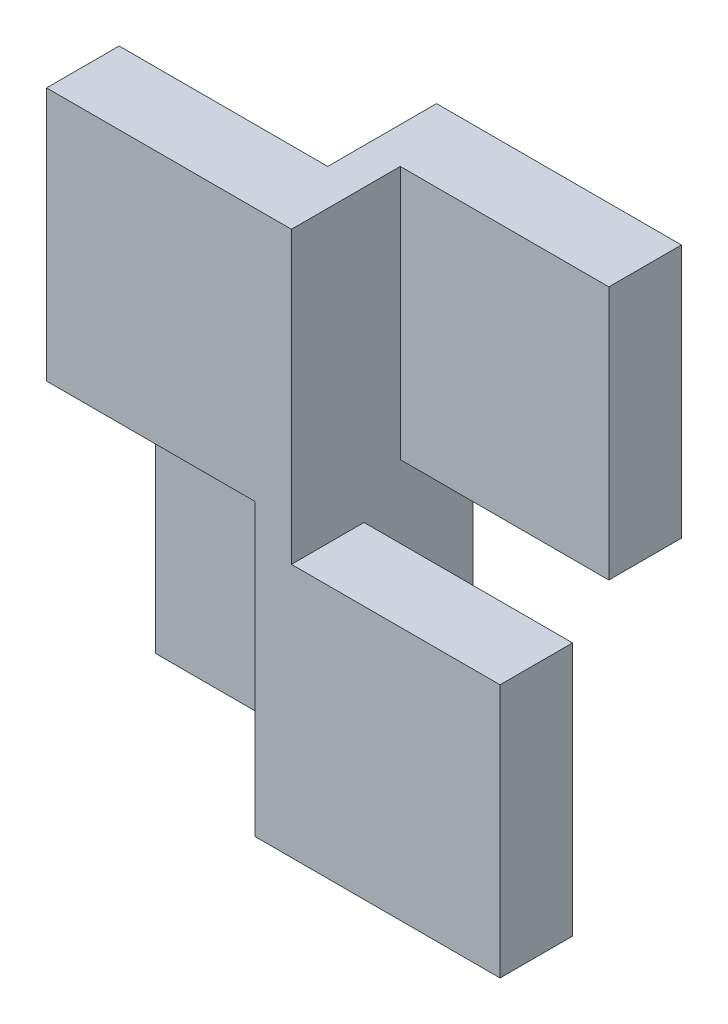
ISO-10303-21;
HEADER;
FILE_DESCRIPTION(('STEP AP214'),'2;1');
FILE_NAME('part.step','',(''),(''),'','','');
FILE_SCHEMA(('AUTOMOTIVE_DESIGN { 1 0 10303 214 1 1 1 1 }'));
ENDSEC;
DATA;
#1=APPLICATION_CONTEXT('core data for automotive mechanical design processes');
#2=APPLICATION_PROTOCOL_DEFINITION('international standard','automotive_design',2000,#1);
#3=PRODUCT_CONTEXT('',#1,'mechanical');
#4=PRODUCT('Part','Part','',(#3));
#5=PRODUCT_RELATED_PRODUCT_CATEGORY('part','',(#4));
#6=PRODUCT_DEFINITION_FORMATION('','',#4);
#7=PRODUCT_DEFINITION_CONTEXT('part definition',#1,'design');
#8=PRODUCT_DEFINITION('design','',#6,#7);
#9=PRODUCT_DEFINITION_SHAPE('','',#8);
#10=(LENGTH_UNIT() NAMED_UNIT(*) SI_UNIT(.MILLI.,.METRE.));
#11=(NAMED_UNIT(*) PLANE_ANGLE_UNIT() SI_UNIT($,.RADIAN.));
#12=(NAMED_UNIT(*) SI_UNIT($,.STERADIAN.) SOLID_ANGLE_UNIT());
#13=UNCERTAINTY_MEASURE_WITH_UNIT(LENGTH_MEASURE(1.E-05),#10,'distance_accuracy_value','');
#14=(GEOMETRIC_REPRESENTATION_CONTEXT(3) GLOBAL_UNCERTAINTY_ASSIGNED_CONTEXT((#13)) GLOBAL_UNIT_ASSIGNED_CONTEXT((#10,
#11,#12)) REPRESENTATION_CONTEXT('',''));
#15=CARTESIAN_POINT('',(0.,0.,0.));
#16=DIRECTION('',(0.,0.,1.));
#17=DIRECTION('',(1.,0.,0.));
#18=AXIS2_PLACEMENT_3D('',#15,#16,#17);
#19=CARTESIAN_POINT('',(0.25,0.,0.1));
#20=DIRECTION('',(-1.,0.,0.));
#21=DIRECTION('',(0.,0.,1.));
#22=AXIS2_PLACEMENT_3D('',#19,#20,#21);
#23=PLANE('',#22);
#24=DIRECTION('',(0.,0.,-1.));
#25=VECTOR('',#24,1.);
#26=CARTESIAN_POINT('',(0.25,0.,0.1));
#27=LINE('',#26,#25);
#28=CARTESIAN_POINT('',(0.25,0.,0.1));
#29=VERTEX_POINT('',#28);
#30=CARTESIAN_POINT('',(0.25,0.,0.06));
#31=VERTEX_POINT('',#30);
#32=EDGE_CURVE('E11',#29,#31,#27,.T.);
#33=ORIENTED_EDGE('',*,*,#32,.T.);
#34=DIRECTION('',(0.,-1.,0.));
#35=VECTOR('',#34,1.);
#36=CARTESIAN_POINT('',(0.25,0.,0.06));
#37=LINE('',#36,#35);
#38=CARTESIAN_POINT('',(0.25,0.14,0.06));
#39=VERTEX_POINT('',#38);
#40=EDGE_CURVE('E167',#39,#31,#37,.T.);
#41=ORIENTED_EDGE('',*,*,#40,.F.);
#42=DIRECTION('',(0.,0.,-1.));
#43=VECTOR('',#42,1.);
#44=CARTESIAN_POINT('',(0.25,0.14,0.06));
#45=LINE('',#44,#43);
#46=CARTESIAN_POINT('',(0.25,0.14,0.1));
#47=VERTEX_POINT('',#46);
#48=EDGE_CURVE('E284',#47,#39,#45,.T.);
#49=ORIENTED_EDGE('',*,*,#48,.F.);
#50=DIRECTION('',(0.,1.,0.));
#51=VECTOR('',#50,1.);
#52=CARTESIAN_POINT('',(0.25,0.,0.1));
#53=LINE('',#52,#51);
#54=EDGE_CURVE('E228',#29,#47,#53,.T.);
#55=ORIENTED_EDGE('',*,*,#54,.F.);
#56=EDGE_LOOP('',(#33,#41,#49,#55));
#57=FACE_BOUND('',#56,.T.);
#58=ADVANCED_FACE('F35',(#57),#23,.F.);
#59=CARTESIAN_POINT('',(0.,0.,0.1));
#60=DIRECTION('',(-1.,0.,0.));
#61=DIRECTION('',(0.,0.,1.));
#62=AXIS2_PLACEMENT_3D('',#59,#60,#61);
#63=PLANE('',#62);
#64=DIRECTION('',(0.,-1.,0.));
#65=VECTOR('',#64,1.);
#66=CARTESIAN_POINT('',(0.,0.,0.04));
#67=LINE('',#66,#65);
#68=CARTESIAN_POINT('',(0.,0.14,0.04));
#69=VERTEX_POINT('',#68);
#70=CARTESIAN_POINT('',(0.,0.,0.04));
#71=VERTEX_POINT('',#70);
#72=EDGE_CURVE('E185',#69,#71,#67,.T.);
#73=ORIENTED_EDGE('',*,*,#72,.F.);
#74=DIRECTION('',(0.,0.,1.));
#75=VECTOR('',#74,1.);
#76=CARTESIAN_POINT('',(0.,0.14,0.04));
#77=LINE('',#76,#75);
#78=CARTESIAN_POINT('',(0.,0.14,0.));
#79=VERTEX_POINT('',#78);
#80=EDGE_CURVE('E208',#79,#69,#77,.T.);
#81=ORIENTED_EDGE('',*,*,#80,.F.);
#82=DIRECTION('',(0.,1.,0.));
#83=VECTOR('',#82,1.);
#84=CARTESIAN_POINT('',(0.,0.,0.));
#85=LINE('',#84,#83);
#86=CARTESIAN_POINT('',(0.,0.,0.));
#87=VERTEX_POINT('',#86);
#88=EDGE_CURVE('E229',#87,#79,#85,.T.);
#89=ORIENTED_EDGE('',*,*,#88,.F.);
#90=DIRECTION('',(0.,0.,-1.));
#91=VECTOR('',#90,1.);
#92=CARTESIAN_POINT('',(0.,0.,0.1));
#93=LINE('',#92,#91);
#94=EDGE_CURVE('E237',#71,#87,#93,.T.);
#95=ORIENTED_EDGE('',*,*,#94,.F.);
#96=EDGE_LOOP('',(#73,#81,#89,#95));
#97=FACE_BOUND('',#96,.T.);
#98=ADVANCED_FACE('F272',(#97),#63,.T.);
#99=CARTESIAN_POINT('',(0.,0.,0.1));
#100=DIRECTION('',(0.,1.,0.));
#101=DIRECTION('',(0.,0.,1.));
#102=AXIS2_PLACEMENT_3D('',#99,#100,#101);
#103=PLANE('',#102);
#104=DIRECTION('',(0.,0.,-1.));
#105=VECTOR('',#104,1.);
#106=CARTESIAN_POINT('',(0.135,0.,0.));
#107=LINE('',#106,#105);
#108=CARTESIAN_POINT('',(0.135,0.,0.06));
#109=VERTEX_POINT('',#108);
#110=CARTESIAN_POINT('',(0.135,0.,0.));
#111=VERTEX_POINT('',#110);
#112=EDGE_CURVE('E50',#109,#111,#107,.T.);
#113=ORIENTED_EDGE('',*,*,#112,.F.);
#114=DIRECTION('',(1.,0.,0.));
#115=VECTOR('',#114,1.);
#116=CARTESIAN_POINT('',(0.135,0.,0.06));
#117=LINE('',#116,#115);
#118=EDGE_CURVE('E206',#109,#31,#117,.T.);
#119=ORIENTED_EDGE('',*,*,#118,.T.);
#120=ORIENTED_EDGE('',*,*,#32,.F.);
#121=DIRECTION('',(1.,0.,0.));
#122=VECTOR('',#121,1.);
#123=CARTESIAN_POINT('',(0.,0.,0.1));
#124=LINE('',#123,#122);
#125=CARTESIAN_POINT('',(0.115,0.,0.1));
#126=VERTEX_POINT('',#125);
#127=EDGE_CURVE('E226',#126,#29,#124,.T.);
#128=ORIENTED_EDGE('',*,*,#127,.F.);
#129=DIRECTION('',(0.,0.,1.));
#130=VECTOR('',#129,1.);
#131=CARTESIAN_POINT('',(0.115,0.,0.1));
#132=LINE('',#131,#130);
#133=CARTESIAN_POINT('',(0.115,0.,0.04));
#134=VERTEX_POINT('',#133);
#135=EDGE_CURVE('E199',#134,#126,#132,.T.);
#136=ORIENTED_EDGE('',*,*,#135,.F.);
#137=DIRECTION('',(-1.,0.,0.));
#138=VECTOR('',#137,1.);
#139=CARTESIAN_POINT('',(0.115,0.,0.04));
#140=LINE('',#139,#138);
#141=EDGE_CURVE('E212',#134,#71,#140,.T.);
#142=ORIENTED_EDGE('',*,*,#141,.T.);
#143=ORIENTED_EDGE('',*,*,#94,.T.);
#144=DIRECTION('',(1.,0.,0.));
#145=VECTOR('',#144,1.);
#146=CARTESIAN_POINT('',(0.,0.,0.));
#147=LINE('',#146,#145);
#148=EDGE_CURVE('E215',#87,#111,#147,.T.);
#149=ORIENTED_EDGE('',*,*,#148,.T.);
#150=EDGE_LOOP('',(#113,#119,#120,#128,#136,#142,#143,#149));
#151=FACE_BOUND('',#150,.T.);
#152=ADVANCED_FACE('F37',(#151),#103,.F.);
#153=DIRECTION('',(0.,0.,-1.));
#154=VECTOR('',#153,1.);
#155=CARTESIAN_POINT('',(0.25,0.3,0.1));
#156=LINE('',#155,#154);
#157=CARTESIAN_POINT('',(0.25,0.3,0.04));
#158=VERTEX_POINT('',#157);
#159=CARTESIAN_POINT('',(0.25,0.3,0.));
#160=VERTEX_POINT('',#159);
#161=EDGE_CURVE('E43',#158,#160,#156,.T.);
#162=ORIENTED_EDGE('',*,*,#161,.F.);
#163=DIRECTION('',(0.,1.,0.));
#164=VECTOR('',#163,1.);
#165=CARTESIAN_POINT('',(0.25,0.3,0.04));
#166=LINE('',#165,#164);
#167=CARTESIAN_POINT('',(0.25,0.16,0.04));
#168=VERTEX_POINT('',#167);
#169=EDGE_CURVE('E316',#168,#158,#166,.T.);
#170=ORIENTED_EDGE('',*,*,#169,.F.);
#171=DIRECTION('',(0.,0.,1.));
#172=VECTOR('',#171,1.);
#173=CARTESIAN_POINT('',(0.25,0.16,0.04));
#174=LINE('',#173,#172);
#175=CARTESIAN_POINT('',(0.25,0.16,0.));
#176=VERTEX_POINT('',#175);
#177=EDGE_CURVE('E256',#176,#168,#174,.T.);
#178=ORIENTED_EDGE('',*,*,#177,.F.);
#179=DIRECTION('',(0.,1.,0.));
#180=VECTOR('',#179,1.);
#181=CARTESIAN_POINT('',(0.25,0.,0.));
#182=LINE('',#181,#180);
#183=EDGE_CURVE('E173',#176,#160,#182,.T.);
#184=ORIENTED_EDGE('',*,*,#183,.T.);
#185=EDGE_LOOP('',(#162,#170,#178,#184));
#186=FACE_BOUND('',#185,.T.);
#187=ADVANCED_FACE('F255',(#186),#23,.F.);
#188=CARTESIAN_POINT('',(0.,0.3,0.1));
#189=DIRECTION('',(0.,1.,0.));
#190=DIRECTION('',(0.,0.,1.));
#191=AXIS2_PLACEMENT_3D('',#188,#189,#190);
#192=PLANE('',#191);
#193=DIRECTION('',(1.,0.,0.));
#194=VECTOR('',#193,1.);
#195=CARTESIAN_POINT('',(0.135,0.3,0.04));
#196=LINE('',#195,#194);
#197=CARTESIAN_POINT('',(0.135,0.3,0.04));
#198=VERTEX_POINT('',#197);
#199=EDGE_CURVE('E175',#198,#158,#196,.T.);
#200=ORIENTED_EDGE('',*,*,#199,.T.);
#201=ORIENTED_EDGE('',*,*,#161,.T.);
#202=DIRECTION('',(1.,0.,0.));
#203=VECTOR('',#202,1.);
#204=CARTESIAN_POINT('',(0.,0.3,0.));
#205=LINE('',#204,#203);
#206=CARTESIAN_POINT('',(0.115,0.3,0.));
#207=VERTEX_POINT('',#206);
#208=EDGE_CURVE('E240',#207,#160,#205,.T.);
#209=ORIENTED_EDGE('',*,*,#208,.F.);
#210=DIRECTION('',(0.,0.,-1.));
#211=VECTOR('',#210,1.);
#212=CARTESIAN_POINT('',(0.115,0.3,0.));
#213=LINE('',#212,#211);
#214=CARTESIAN_POINT('',(0.115,0.3,0.06));
#215=VERTEX_POINT('',#214);
#216=EDGE_CURVE('E58',#215,#207,#213,.T.);
#217=ORIENTED_EDGE('',*,*,#216,.F.);
#218=DIRECTION('',(-1.,0.,0.));
#219=VECTOR('',#218,1.);
#220=CARTESIAN_POINT('',(0.115,0.3,0.06));
#221=LINE('',#220,#219);
#222=CARTESIAN_POINT('',(0.,0.3,0.06));
#223=VERTEX_POINT('',#222);
#224=EDGE_CURVE('E220',#215,#223,#221,.T.);
#225=ORIENTED_EDGE('',*,*,#224,.T.);
#226=DIRECTION('',(0.,0.,-1.));
#227=VECTOR('',#226,1.);
#228=CARTESIAN_POINT('',(0.,0.3,0.1));
#229=LINE('',#228,#227);
#230=CARTESIAN_POINT('',(0.,0.3,0.1));
#231=VERTEX_POINT('',#230);
#232=EDGE_CURVE('E245',#231,#223,#229,.T.);
#233=ORIENTED_EDGE('',*,*,#232,.F.);
#234=DIRECTION('',(1.,0.,0.));
#235=VECTOR('',#234,1.);
#236=CARTESIAN_POINT('',(0.,0.3,0.1));
#237=LINE('',#236,#235);
#238=CARTESIAN_POINT('',(0.135,0.3,0.1));
#239=VERTEX_POINT('',#238);
#240=EDGE_CURVE('E232',#231,#239,#237,.T.);
#241=ORIENTED_EDGE('',*,*,#240,.T.);
#242=DIRECTION('',(0.,0.,1.));
#243=VECTOR('',#242,1.);
#244=CARTESIAN_POINT('',(0.135,0.3,0.1));
#245=LINE('',#244,#243);
#246=EDGE_CURVE('E306',#198,#239,#245,.T.);
#247=ORIENTED_EDGE('',*,*,#246,.F.);
#248=EDGE_LOOP('',(#200,#201,#209,#217,#225,#233,#241,#247));
#249=FACE_BOUND('',#248,.T.);
#250=ADVANCED_FACE('F251',(#249),#192,.T.);
#251=DIRECTION('',(0.,1.,0.));
#252=VECTOR('',#251,1.);
#253=CARTESIAN_POINT('',(0.,0.3,0.06));
#254=LINE('',#253,#252);
#255=CARTESIAN_POINT('',(0.,0.16,0.06));
#256=VERTEX_POINT('',#255);
#257=EDGE_CURVE('E205',#256,#223,#254,.T.);
#258=ORIENTED_EDGE('',*,*,#257,.F.);
#259=DIRECTION('',(0.,0.,-1.));
#260=VECTOR('',#259,1.);
#261=CARTESIAN_POINT('',(0.,0.16,0.06));
#262=LINE('',#261,#260);
#263=CARTESIAN_POINT('',(0.,0.16,0.1));
#264=VERTEX_POINT('',#263);
#265=EDGE_CURVE('E202',#264,#256,#262,.T.);
#266=ORIENTED_EDGE('',*,*,#265,.F.);
#267=DIRECTION('',(0.,1.,0.));
#268=VECTOR('',#267,1.);
#269=CARTESIAN_POINT('',(0.,0.,0.1));
#270=LINE('',#269,#268);
#271=EDGE_CURVE('E235',#264,#231,#270,.T.);
#272=ORIENTED_EDGE('',*,*,#271,.T.);
#273=ORIENTED_EDGE('',*,*,#232,.T.);
#274=EDGE_LOOP('',(#258,#266,#272,#273));
#275=FACE_BOUND('',#274,.T.);
#276=ADVANCED_FACE('F303',(#275),#63,.T.);
#277=CARTESIAN_POINT('',(0.,0.,0.1));
#278=DIRECTION('',(0.,0.,1.));
#279=DIRECTION('',(1.,0.,0.));
#280=AXIS2_PLACEMENT_3D('',#277,#278,#279);
#281=PLANE('',#280);
#282=DIRECTION('',(1.,0.,0.));
#283=VECTOR('',#282,1.);
#284=CARTESIAN_POINT('',(0.135,0.14,0.1));
#285=LINE('',#284,#283);
#286=CARTESIAN_POINT('',(0.135,0.14,0.1));
#287=VERTEX_POINT('',#286);
#288=EDGE_CURVE('E289',#287,#47,#285,.T.);
#289=ORIENTED_EDGE('',*,*,#288,.F.);
#290=DIRECTION('',(0.,-1.,0.));
#291=VECTOR('',#290,1.);
#292=CARTESIAN_POINT('',(0.135,0.14,0.1));
#293=LINE('',#292,#291);
#294=EDGE_CURVE('E305',#239,#287,#293,.T.);
#295=ORIENTED_EDGE('',*,*,#294,.F.);
#296=ORIENTED_EDGE('',*,*,#240,.F.);
#297=ORIENTED_EDGE('',*,*,#271,.F.);
#298=DIRECTION('',(-1.,0.,0.));
#299=VECTOR('',#298,1.);
#300=CARTESIAN_POINT('',(0.115,0.16,0.1));
#301=LINE('',#300,#299);
#302=CARTESIAN_POINT('',(0.115,0.16,0.1));
#303=VERTEX_POINT('',#302);
#304=EDGE_CURVE('E201',#303,#264,#301,.T.);
#305=ORIENTED_EDGE('',*,*,#304,.F.);
#306=DIRECTION('',(0.,1.,0.));
#307=VECTOR('',#306,1.);
#308=CARTESIAN_POINT('',(0.115,0.16,0.1));
#309=LINE('',#308,#307);
#310=EDGE_CURVE('E181',#126,#303,#309,.T.);
#311=ORIENTED_EDGE('',*,*,#310,.F.);
#312=ORIENTED_EDGE('',*,*,#127,.T.);
#313=ORIENTED_EDGE('',*,*,#54,.T.);
#314=EDGE_LOOP('',(#289,#295,#296,#297,#305,#311,#312,#313));
#315=FACE_BOUND('',#314,.T.);
#316=ADVANCED_FACE('F287',(#315),#281,.T.);
#317=CARTESIAN_POINT('',(0.,0.,0.));
#318=DIRECTION('',(0.,0.,1.));
#319=DIRECTION('',(1.,0.,0.));
#320=AXIS2_PLACEMENT_3D('',#317,#318,#319);
#321=PLANE('',#320);
#322=ORIENTED_EDGE('',*,*,#183,.F.);
#323=DIRECTION('',(1.,0.,0.));
#324=VECTOR('',#323,1.);
#325=CARTESIAN_POINT('',(0.135,0.16,0.));
#326=LINE('',#325,#324);
#327=CARTESIAN_POINT('',(0.135,0.16,0.));
#328=VERTEX_POINT('',#327);
#329=EDGE_CURVE('E155',#328,#176,#326,.T.);
#330=ORIENTED_EDGE('',*,*,#329,.F.);
#331=DIRECTION('',(0.,1.,0.));
#332=VECTOR('',#331,1.);
#333=CARTESIAN_POINT('',(0.135,0.16,0.));
#334=LINE('',#333,#332);
#335=EDGE_CURVE('E161',#111,#328,#334,.T.);
#336=ORIENTED_EDGE('',*,*,#335,.F.);
#337=ORIENTED_EDGE('',*,*,#148,.F.);
#338=ORIENTED_EDGE('',*,*,#88,.T.);
#339=DIRECTION('',(-1.,0.,0.));
#340=VECTOR('',#339,1.);
#341=CARTESIAN_POINT('',(0.115,0.14,0.));
#342=LINE('',#341,#340);
#343=CARTESIAN_POINT('',(0.115,0.14,0.));
#344=VERTEX_POINT('',#343);
#345=EDGE_CURVE('E218',#344,#79,#342,.T.);
#346=ORIENTED_EDGE('',*,*,#345,.F.);
#347=DIRECTION('',(0.,-1.,0.));
#348=VECTOR('',#347,1.);
#349=CARTESIAN_POINT('',(0.115,0.14,0.));
#350=LINE('',#349,#348);
#351=EDGE_CURVE('E191',#207,#344,#350,.T.);
#352=ORIENTED_EDGE('',*,*,#351,.F.);
#353=ORIENTED_EDGE('',*,*,#208,.T.);
#354=EDGE_LOOP('',(#322,#330,#336,#337,#338,#346,#352,#353));
#355=FACE_BOUND('',#354,.T.);
#356=ADVANCED_FACE('F170',(#355),#321,.F.);
#357=CARTESIAN_POINT('',(0.115,0.,0.04));
#358=DIRECTION('',(0.,0.,-1.));
#359=DIRECTION('',(-1.,0.,0.));
#360=AXIS2_PLACEMENT_3D('',#357,#358,#359);
#361=PLANE('',#360);
#362=ORIENTED_EDGE('',*,*,#72,.T.);
#363=ORIENTED_EDGE('',*,*,#141,.F.);
#364=DIRECTION('',(0.,-1.,0.));
#365=VECTOR('',#364,1.);
#366=CARTESIAN_POINT('',(0.115,0.,0.04));
#367=LINE('',#366,#365);
#368=CARTESIAN_POINT('',(0.115,0.14,0.04));
#369=VERTEX_POINT('',#368);
#370=EDGE_CURVE('E196',#369,#134,#367,.T.);
#371=ORIENTED_EDGE('',*,*,#370,.F.);
#372=DIRECTION('',(-1.,0.,0.));
#373=VECTOR('',#372,1.);
#374=CARTESIAN_POINT('',(0.115,0.14,0.04));
#375=LINE('',#374,#373);
#376=EDGE_CURVE('E216',#369,#69,#375,.T.);
#377=ORIENTED_EDGE('',*,*,#376,.T.);
#378=EDGE_LOOP('',(#362,#363,#371,#377));
#379=FACE_BOUND('',#378,.T.);
#380=ADVANCED_FACE('F266',(#379),#361,.F.);
#381=CARTESIAN_POINT('',(0.115,0.14,0.04));
#382=DIRECTION('',(0.,-1.,0.));
#383=DIRECTION('',(0.,0.,-1.));
#384=AXIS2_PLACEMENT_3D('',#381,#382,#383);
#385=PLANE('',#384);
#386=ORIENTED_EDGE('',*,*,#80,.T.);
#387=ORIENTED_EDGE('',*,*,#376,.F.);
#388=DIRECTION('',(0.,0.,1.));
#389=VECTOR('',#388,1.);
#390=CARTESIAN_POINT('',(0.115,0.14,0.04));
#391=LINE('',#390,#389);
#392=EDGE_CURVE('E193',#344,#369,#391,.T.);
#393=ORIENTED_EDGE('',*,*,#392,.F.);
#394=ORIENTED_EDGE('',*,*,#345,.T.);
#395=EDGE_LOOP('',(#386,#387,#393,#394));
#396=FACE_BOUND('',#395,.T.);
#397=ADVANCED_FACE('F262',(#396),#385,.F.);
#398=CARTESIAN_POINT('',(0.115,0.3,0.06));
#399=DIRECTION('',(0.,0.,1.));
#400=DIRECTION('',(0.,-1.,0.));
#401=AXIS2_PLACEMENT_3D('',#398,#399,#400);
#402=PLANE('',#401);
#403=ORIENTED_EDGE('',*,*,#257,.T.);
#404=ORIENTED_EDGE('',*,*,#224,.F.);
#405=DIRECTION('',(0.,1.,0.));
#406=VECTOR('',#405,1.);
#407=CARTESIAN_POINT('',(0.115,0.3,0.06));
#408=LINE('',#407,#406);
#409=CARTESIAN_POINT('',(0.115,0.16,0.06));
#410=VERTEX_POINT('',#409);
#411=EDGE_CURVE('E188',#410,#215,#408,.T.);
#412=ORIENTED_EDGE('',*,*,#411,.F.);
#413=DIRECTION('',(-1.,0.,0.));
#414=VECTOR('',#413,1.);
#415=CARTESIAN_POINT('',(0.115,0.16,0.06));
#416=LINE('',#415,#414);
#417=EDGE_CURVE('E223',#410,#256,#416,.T.);
#418=ORIENTED_EDGE('',*,*,#417,.T.);
#419=EDGE_LOOP('',(#403,#404,#412,#418));
#420=FACE_BOUND('',#419,.T.);
#421=ADVANCED_FACE('F299',(#420),#402,.F.);
#422=CARTESIAN_POINT('',(0.115,0.16,0.06));
#423=DIRECTION('',(0.,1.,0.));
#424=DIRECTION('',(0.,0.,1.));
#425=AXIS2_PLACEMENT_3D('',#422,#423,#424);
#426=PLANE('',#425);
#427=ORIENTED_EDGE('',*,*,#265,.T.);
#428=ORIENTED_EDGE('',*,*,#417,.F.);
#429=DIRECTION('',(0.,0.,-1.));
#430=VECTOR('',#429,1.);
#431=CARTESIAN_POINT('',(0.115,0.16,0.06));
#432=LINE('',#431,#430);
#433=EDGE_CURVE('E184',#303,#410,#432,.T.);
#434=ORIENTED_EDGE('',*,*,#433,.F.);
#435=ORIENTED_EDGE('',*,*,#304,.T.);
#436=EDGE_LOOP('',(#427,#428,#434,#435));
#437=FACE_BOUND('',#436,.T.);
#438=ADVANCED_FACE('F295',(#437),#426,.F.);
#439=CARTESIAN_POINT('',(0.115,0.,0.));
#440=DIRECTION('',(1.,0.,0.));
#441=DIRECTION('',(0.,0.,-1.));
#442=AXIS2_PLACEMENT_3D('',#439,#440,#441);
#443=PLANE('',#442);
#444=ORIENTED_EDGE('',*,*,#310,.T.);
#445=ORIENTED_EDGE('',*,*,#433,.T.);
#446=ORIENTED_EDGE('',*,*,#411,.T.);
#447=ORIENTED_EDGE('',*,*,#216,.T.);
#448=ORIENTED_EDGE('',*,*,#351,.T.);
#449=ORIENTED_EDGE('',*,*,#392,.T.);
#450=ORIENTED_EDGE('',*,*,#370,.T.);
#451=ORIENTED_EDGE('',*,*,#135,.T.);
#452=EDGE_LOOP('',(#444,#445,#446,#447,#448,#449,#450,#451));
#453=FACE_BOUND('',#452,.T.);
#454=ADVANCED_FACE('F258',(#453),#443,.F.);
#455=CARTESIAN_POINT('',(0.135,0.,0.06));
#456=DIRECTION('',(0.,0.,1.));
#457=DIRECTION('',(0.,-1.,0.));
#458=AXIS2_PLACEMENT_3D('',#455,#456,#457);
#459=PLANE('',#458);
#460=ORIENTED_EDGE('',*,*,#40,.T.);
#461=ORIENTED_EDGE('',*,*,#118,.F.);
#462=DIRECTION('',(0.,-1.,0.));
#463=VECTOR('',#462,1.);
#464=CARTESIAN_POINT('',(0.135,0.,0.06));
#465=LINE('',#464,#463);
#466=CARTESIAN_POINT('',(0.135,0.14,0.06));
#467=VERTEX_POINT('',#466);
#468=EDGE_CURVE('E177',#467,#109,#465,.T.);
#469=ORIENTED_EDGE('',*,*,#468,.F.);
#470=DIRECTION('',(1.,0.,0.));
#471=VECTOR('',#470,1.);
#472=CARTESIAN_POINT('',(0.135,0.14,0.06));
#473=LINE('',#472,#471);
#474=EDGE_CURVE('E277',#467,#39,#473,.T.);
#475=ORIENTED_EDGE('',*,*,#474,.T.);
#476=EDGE_LOOP('',(#460,#461,#469,#475));
#477=FACE_BOUND('',#476,.T.);
#478=ADVANCED_FACE('F323',(#477),#459,.F.);
#479=CARTESIAN_POINT('',(0.135,0.14,0.06));
#480=DIRECTION('',(0.,-1.,0.));
#481=DIRECTION('',(0.,0.,-1.));
#482=AXIS2_PLACEMENT_3D('',#479,#480,#481);
#483=PLANE('',#482);
#484=ORIENTED_EDGE('',*,*,#48,.T.);
#485=ORIENTED_EDGE('',*,*,#474,.F.);
#486=DIRECTION('',(0.,0.,-1.));
#487=VECTOR('',#486,1.);
#488=CARTESIAN_POINT('',(0.135,0.14,0.06));
#489=LINE('',#488,#487);
#490=EDGE_CURVE('E308',#287,#467,#489,.T.);
#491=ORIENTED_EDGE('',*,*,#490,.F.);
#492=ORIENTED_EDGE('',*,*,#288,.T.);
#493=EDGE_LOOP('',(#484,#485,#491,#492));
#494=FACE_BOUND('',#493,.T.);
#495=ADVANCED_FACE('F322',(#494),#483,.F.);
#496=CARTESIAN_POINT('',(0.135,0.3,0.04));
#497=DIRECTION('',(0.,0.,-1.));
#498=DIRECTION('',(-1.,0.,0.));
#499=AXIS2_PLACEMENT_3D('',#496,#497,#498);
#500=PLANE('',#499);
#501=ORIENTED_EDGE('',*,*,#169,.T.);
#502=ORIENTED_EDGE('',*,*,#199,.F.);
#503=DIRECTION('',(0.,1.,0.));
#504=VECTOR('',#503,1.);
#505=CARTESIAN_POINT('',(0.135,0.3,0.04));
#506=LINE('',#505,#504);
#507=CARTESIAN_POINT('',(0.135,0.16,0.04));
#508=VERTEX_POINT('',#507);
#509=EDGE_CURVE('E160',#508,#198,#506,.T.);
#510=ORIENTED_EDGE('',*,*,#509,.F.);
#511=DIRECTION('',(1.,0.,0.));
#512=VECTOR('',#511,1.);
#513=CARTESIAN_POINT('',(0.135,0.16,0.04));
#514=LINE('',#513,#512);
#515=EDGE_CURVE('E157',#508,#168,#514,.T.);
#516=ORIENTED_EDGE('',*,*,#515,.T.);
#517=EDGE_LOOP('',(#501,#502,#510,#516));
#518=FACE_BOUND('',#517,.T.);
#519=ADVANCED_FACE('F330',(#518),#500,.F.);
#520=CARTESIAN_POINT('',(0.135,0.16,0.04));
#521=DIRECTION('',(0.,1.,0.));
#522=DIRECTION('',(0.,0.,1.));
#523=AXIS2_PLACEMENT_3D('',#520,#521,#522);
#524=PLANE('',#523);
#525=ORIENTED_EDGE('',*,*,#177,.T.);
#526=ORIENTED_EDGE('',*,*,#515,.F.);
#527=DIRECTION('',(0.,0.,1.));
#528=VECTOR('',#527,1.);
#529=CARTESIAN_POINT('',(0.135,0.16,0.04));
#530=LINE('',#529,#528);
#531=EDGE_CURVE('E151',#328,#508,#530,.T.);
#532=ORIENTED_EDGE('',*,*,#531,.F.);
#533=ORIENTED_EDGE('',*,*,#329,.T.);
#534=EDGE_LOOP('',(#525,#526,#532,#533));
#535=FACE_BOUND('',#534,.T.);
#536=ADVANCED_FACE('F153',(#535),#524,.F.);
#537=CARTESIAN_POINT('',(0.135,0.,0.));
#538=DIRECTION('',(-1.,0.,0.));
#539=DIRECTION('',(0.,0.,1.));
#540=AXIS2_PLACEMENT_3D('',#537,#538,#539);
#541=PLANE('',#540);
#542=ORIENTED_EDGE('',*,*,#335,.T.);
#543=ORIENTED_EDGE('',*,*,#531,.T.);
#544=ORIENTED_EDGE('',*,*,#509,.T.);
#545=ORIENTED_EDGE('',*,*,#246,.T.);
#546=ORIENTED_EDGE('',*,*,#294,.T.);
#547=ORIENTED_EDGE('',*,*,#490,.T.);
#548=ORIENTED_EDGE('',*,*,#468,.T.);
#549=ORIENTED_EDGE('',*,*,#112,.T.);
#550=EDGE_LOOP('',(#542,#543,#544,#545,#546,#547,#548,#549));
#551=FACE_BOUND('',#550,.T.);
#552=ADVANCED_FACE('F163',(#551),#541,.F.);
#553=CLOSED_SHELL('',(#58,#98,#152,#187,#250,#276,#316,#356,#380,#397,#421,#438,#454,#478,#495,
#519,#536,#552));
#554=MANIFOLD_SOLID_BREP('B2',#553);
#555=ADVANCED_BREP_SHAPE_REPRESENTATION('',(#18,#554),#14);
#556=SHAPE_DEFINITION_REPRESENTATION(#9,#555);
ENDSEC;
END-ISO-10303-21;
